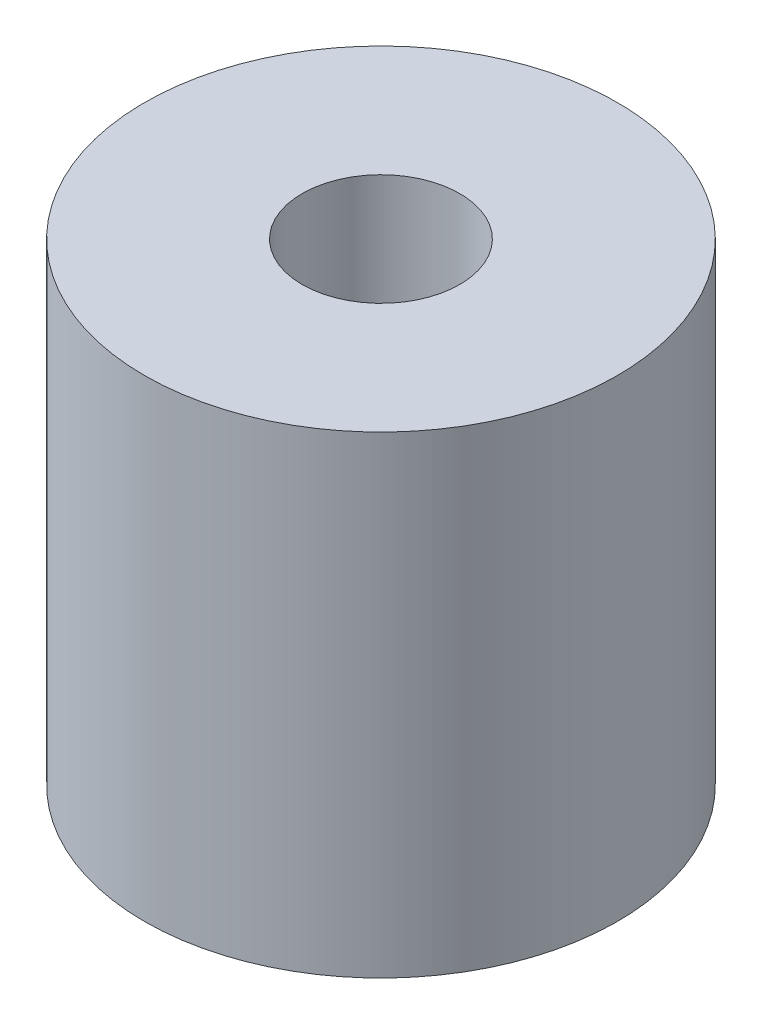
ISO-10303-21;
HEADER;
FILE_DESCRIPTION(('STEP AP214'),'2;1');
FILE_NAME('part.step','',(''),(''),'','','');
FILE_SCHEMA(('AUTOMOTIVE_DESIGN { 1 0 10303 214 1 1 1 1 }'));
ENDSEC;
DATA;
#1=APPLICATION_CONTEXT('core data for automotive mechanical design processes');
#2=APPLICATION_PROTOCOL_DEFINITION('international standard','automotive_design',2000,#1);
#3=PRODUCT_CONTEXT('',#1,'mechanical');
#4=PRODUCT('Part','Part','',(#3));
#5=PRODUCT_RELATED_PRODUCT_CATEGORY('part','',(#4));
#6=PRODUCT_DEFINITION_FORMATION('','',#4);
#7=PRODUCT_DEFINITION_CONTEXT('part definition',#1,'design');
#8=PRODUCT_DEFINITION('design','',#6,#7);
#9=PRODUCT_DEFINITION_SHAPE('','',#8);
#10=(LENGTH_UNIT() NAMED_UNIT(*) SI_UNIT(.MILLI.,.METRE.));
#11=(NAMED_UNIT(*) PLANE_ANGLE_UNIT() SI_UNIT($,.RADIAN.));
#12=(NAMED_UNIT(*) SI_UNIT($,.STERADIAN.) SOLID_ANGLE_UNIT());
#13=UNCERTAINTY_MEASURE_WITH_UNIT(LENGTH_MEASURE(1.E-05),#10,'distance_accuracy_value','');
#14=(GEOMETRIC_REPRESENTATION_CONTEXT(3) GLOBAL_UNCERTAINTY_ASSIGNED_CONTEXT((#13)) GLOBAL_UNIT_ASSIGNED_CONTEXT((#10,
#11,#12)) REPRESENTATION_CONTEXT('',''));
#15=CARTESIAN_POINT('',(0.,0.,0.));
#16=DIRECTION('',(0.,0.,1.));
#17=DIRECTION('',(1.,0.,0.));
#18=AXIS2_PLACEMENT_3D('',#15,#16,#17);
#19=CARTESIAN_POINT('',(0.,9.,0.));
#20=DIRECTION('',(0.,1.,0.));
#21=DIRECTION('',(0.,0.,1.));
#22=AXIS2_PLACEMENT_3D('',#19,#20,#21);
#23=PLANE('',#22);
#24=CARTESIAN_POINT('',(0.,9.,0.));
#25=DIRECTION('',(0.,1.,0.));
#26=DIRECTION('',(0.,0.,1.));
#27=AXIS2_PLACEMENT_3D('',#24,#25,#26);
#28=CIRCLE('',#27,4.5);
#29=CARTESIAN_POINT('',(0.,9.,4.5));
#30=VERTEX_POINT('',#29);
#31=EDGE_CURVE('E10',#30,#30,#28,.T.);
#32=ORIENTED_EDGE('',*,*,#31,.T.);
#33=EDGE_LOOP('',(#32));
#34=FACE_BOUND('',#33,.T.);
#35=CARTESIAN_POINT('',(0.,9.,0.));
#36=DIRECTION('',(0.,1.,0.));
#37=DIRECTION('',(0.,0.,1.));
#38=AXIS2_PLACEMENT_3D('',#35,#36,#37);
#39=CIRCLE('',#38,1.5);
#40=CARTESIAN_POINT('',(0.,9.,1.5));
#41=VERTEX_POINT('',#40);
#42=EDGE_CURVE('E46',#41,#41,#39,.T.);
#43=ORIENTED_EDGE('',*,*,#42,.F.);
#44=EDGE_LOOP('',(#43));
#45=FACE_BOUND('',#44,.T.);
#46=ADVANCED_FACE('F35',(#34,#45),#23,.T.);
#47=CARTESIAN_POINT('',(0.,0.,0.));
#48=DIRECTION('',(0.,1.,0.));
#49=DIRECTION('',(0.,0.,1.));
#50=AXIS2_PLACEMENT_3D('',#47,#48,#49);
#51=PLANE('',#50);
#52=CARTESIAN_POINT('',(0.,0.,0.));
#53=DIRECTION('',(0.,1.,0.));
#54=DIRECTION('',(0.,0.,1.));
#55=AXIS2_PLACEMENT_3D('',#52,#53,#54);
#56=CIRCLE('',#55,4.5);
#57=CARTESIAN_POINT('',(0.,0.,4.5));
#58=VERTEX_POINT('',#57);
#59=EDGE_CURVE('E39',#58,#58,#56,.T.);
#60=ORIENTED_EDGE('',*,*,#59,.F.);
#61=EDGE_LOOP('',(#60));
#62=FACE_BOUND('',#61,.T.);
#63=CARTESIAN_POINT('',(0.,0.,0.));
#64=DIRECTION('',(0.,1.,0.));
#65=DIRECTION('',(0.,0.,1.));
#66=AXIS2_PLACEMENT_3D('',#63,#64,#65);
#67=CIRCLE('',#66,1.5);
#68=CARTESIAN_POINT('',(0.,0.,1.5));
#69=VERTEX_POINT('',#68);
#70=EDGE_CURVE('E48',#69,#69,#67,.T.);
#71=ORIENTED_EDGE('',*,*,#70,.T.);
#72=EDGE_LOOP('',(#71));
#73=FACE_BOUND('',#72,.T.);
#74=ADVANCED_FACE('F58',(#62,#73),#51,.F.);
#75=CARTESIAN_POINT('',(0.,9.,0.));
#76=DIRECTION('',(0.,-1.,0.));
#77=DIRECTION('',(0.,0.,-1.));
#78=AXIS2_PLACEMENT_3D('',#75,#76,#77);
#79=CYLINDRICAL_SURFACE('',#78,4.5);
#80=ORIENTED_EDGE('',*,*,#31,.F.);
#81=EDGE_LOOP('',(#80));
#82=FACE_BOUND('',#81,.T.);
#83=ORIENTED_EDGE('',*,*,#59,.T.);
#84=EDGE_LOOP('',(#83));
#85=FACE_BOUND('',#84,.T.);
#86=ADVANCED_FACE('F37',(#82,#85),#79,.T.);
#87=CARTESIAN_POINT('',(0.,9.,0.));
#88=DIRECTION('',(0.,-1.,0.));
#89=DIRECTION('',(0.,0.,-1.));
#90=AXIS2_PLACEMENT_3D('',#87,#88,#89);
#91=CYLINDRICAL_SURFACE('',#90,1.5);
#92=ORIENTED_EDGE('',*,*,#42,.T.);
#93=EDGE_LOOP('',(#92));
#94=FACE_BOUND('',#93,.T.);
#95=ORIENTED_EDGE('',*,*,#70,.F.);
#96=EDGE_LOOP('',(#95));
#97=FACE_BOUND('',#96,.T.);
#98=ADVANCED_FACE('F54',(#94,#97),#91,.F.);
#99=CLOSED_SHELL('',(#46,#74,#86,#98));
#100=MANIFOLD_SOLID_BREP('B2',#99);
#101=ADVANCED_BREP_SHAPE_REPRESENTATION('',(#18,#100),#14);
#102=SHAPE_DEFINITION_REPRESENTATION(#9,#101);
ENDSEC;
END-ISO-10303-21;
